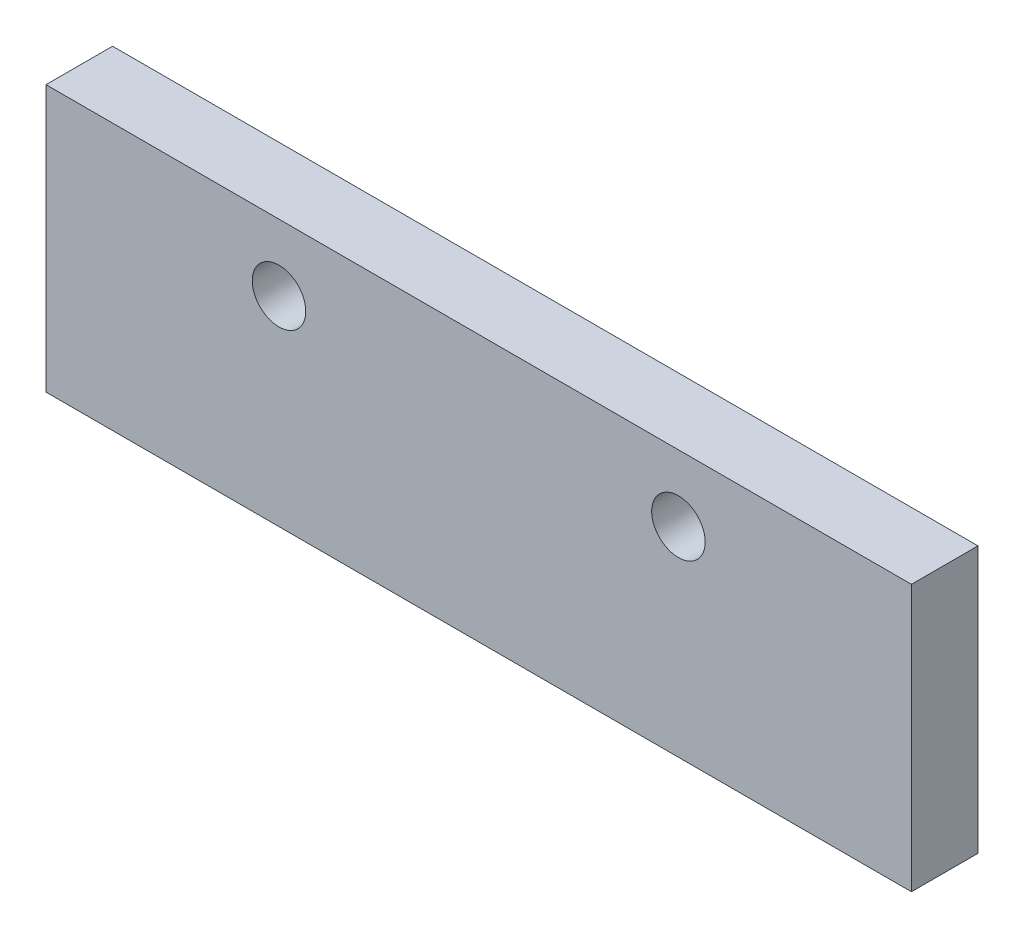
ISO-10303-21;
HEADER;
FILE_DESCRIPTION(('STEP AP214'),'2;1');
FILE_NAME('part.step','',(''),(''),'','','');
FILE_SCHEMA(('AUTOMOTIVE_DESIGN { 1 0 10303 214 1 1 1 1 }'));
ENDSEC;
DATA;
#1=APPLICATION_CONTEXT('core data for automotive mechanical design processes');
#2=APPLICATION_PROTOCOL_DEFINITION('international standard','automotive_design',2000,#1);
#3=PRODUCT_CONTEXT('',#1,'mechanical');
#4=PRODUCT('Part','Part','',(#3));
#5=PRODUCT_RELATED_PRODUCT_CATEGORY('part','',(#4));
#6=PRODUCT_DEFINITION_FORMATION('','',#4);
#7=PRODUCT_DEFINITION_CONTEXT('part definition',#1,'design');
#8=PRODUCT_DEFINITION('design','',#6,#7);
#9=PRODUCT_DEFINITION_SHAPE('','',#8);
#10=(LENGTH_UNIT() NAMED_UNIT(*) SI_UNIT(.MILLI.,.METRE.));
#11=(NAMED_UNIT(*) PLANE_ANGLE_UNIT() SI_UNIT($,.RADIAN.));
#12=(NAMED_UNIT(*) SI_UNIT($,.STERADIAN.) SOLID_ANGLE_UNIT());
#13=UNCERTAINTY_MEASURE_WITH_UNIT(LENGTH_MEASURE(1.E-05),#10,'distance_accuracy_value','');
#14=(GEOMETRIC_REPRESENTATION_CONTEXT(3) GLOBAL_UNCERTAINTY_ASSIGNED_CONTEXT((#13)) GLOBAL_UNIT_ASSIGNED_CONTEXT((#10,
#11,#12)) REPRESENTATION_CONTEXT('',''));
#15=CARTESIAN_POINT('',(0.,0.,0.));
#16=DIRECTION('',(0.,0.,1.));
#17=DIRECTION('',(1.,0.,0.));
#18=AXIS2_PLACEMENT_3D('',#15,#16,#17);
#19=CARTESIAN_POINT('',(0.,0.,0.));
#20=DIRECTION('',(0.,0.,-1.));
#21=DIRECTION('',(-1.,0.,0.));
#22=AXIS2_PLACEMENT_3D('',#19,#20,#21);
#23=PLANE('',#22);
#24=CARTESIAN_POINT('',(60.325,19.05,0.));
#25=DIRECTION('',(0.,0.,1.));
#26=DIRECTION('',(1.,0.,0.));
#27=AXIS2_PLACEMENT_3D('',#24,#25,#26);
#28=CIRCLE('',#27,2.55270000000001);
#29=CARTESIAN_POINT('',(62.8777,19.05,0.));
#30=VERTEX_POINT('',#29);
#31=EDGE_CURVE('E151',#30,#30,#28,.T.);
#32=ORIENTED_EDGE('',*,*,#31,.F.);
#33=EDGE_LOOP('',(#32));
#34=FACE_BOUND('',#33,.T.);
#35=DIRECTION('',(0.,-1.,0.));
#36=VECTOR('',#35,1.);
#37=CARTESIAN_POINT('',(0.,0.,0.));
#38=LINE('',#37,#36);
#39=CARTESIAN_POINT('',(0.,25.4,0.));
#40=VERTEX_POINT('',#39);
#41=CARTESIAN_POINT('',(0.,0.,0.));
#42=VERTEX_POINT('',#41);
#43=EDGE_CURVE('E105',#40,#42,#38,.T.);
#44=ORIENTED_EDGE('',*,*,#43,.T.);
#45=DIRECTION('',(1.,0.,0.));
#46=VECTOR('',#45,1.);
#47=CARTESIAN_POINT('',(0.,0.,0.));
#48=LINE('',#47,#46);
#49=CARTESIAN_POINT('',(82.55,0.,0.));
#50=VERTEX_POINT('',#49);
#51=EDGE_CURVE('E108',#42,#50,#48,.T.);
#52=ORIENTED_EDGE('',*,*,#51,.T.);
#53=DIRECTION('',(0.,1.,0.));
#54=VECTOR('',#53,1.);
#55=CARTESIAN_POINT('',(82.55,0.,0.));
#56=LINE('',#55,#54);
#57=CARTESIAN_POINT('',(82.55,25.4,0.));
#58=VERTEX_POINT('',#57);
#59=EDGE_CURVE('E90',#50,#58,#56,.T.);
#60=ORIENTED_EDGE('',*,*,#59,.T.);
#61=DIRECTION('',(-1.,0.,0.));
#62=VECTOR('',#61,1.);
#63=CARTESIAN_POINT('',(0.,25.4,0.));
#64=LINE('',#63,#62);
#65=EDGE_CURVE('E100',#58,#40,#64,.T.);
#66=ORIENTED_EDGE('',*,*,#65,.T.);
#67=EDGE_LOOP('',(#44,#52,#60,#66));
#68=FACE_BOUND('',#67,.T.);
#69=CARTESIAN_POINT('',(22.225,19.05,0.));
#70=DIRECTION('',(0.,0.,1.));
#71=DIRECTION('',(1.,0.,0.));
#72=AXIS2_PLACEMENT_3D('',#69,#70,#71);
#73=CIRCLE('',#72,2.5527);
#74=CARTESIAN_POINT('',(24.7777,19.05,0.));
#75=VERTEX_POINT('',#74);
#76=EDGE_CURVE('E149',#75,#75,#73,.T.);
#77=ORIENTED_EDGE('',*,*,#76,.F.);
#78=EDGE_LOOP('',(#77));
#79=FACE_BOUND('',#78,.T.);
#80=ADVANCED_FACE('F39',(#34,#68,#79),#23,.F.);
#81=CARTESIAN_POINT('',(0.,0.,-6.35));
#82=DIRECTION('',(-1.,0.,0.));
#83=DIRECTION('',(0.,0.,1.));
#84=AXIS2_PLACEMENT_3D('',#81,#82,#83);
#85=PLANE('',#84);
#86=ORIENTED_EDGE('',*,*,#43,.F.);
#87=DIRECTION('',(0.,0.,1.));
#88=VECTOR('',#87,1.);
#89=CARTESIAN_POINT('',(0.,25.4,-6.35));
#90=LINE('',#89,#88);
#91=CARTESIAN_POINT('',(0.,25.4,-6.35));
#92=VERTEX_POINT('',#91);
#93=EDGE_CURVE('E11',#92,#40,#90,.T.);
#94=ORIENTED_EDGE('',*,*,#93,.F.);
#95=DIRECTION('',(0.,-1.,0.));
#96=VECTOR('',#95,1.);
#97=CARTESIAN_POINT('',(0.,0.,-6.35));
#98=LINE('',#97,#96);
#99=CARTESIAN_POINT('',(0.,0.,-6.35));
#100=VERTEX_POINT('',#99);
#101=EDGE_CURVE('E98',#92,#100,#98,.T.);
#102=ORIENTED_EDGE('',*,*,#101,.T.);
#103=DIRECTION('',(0.,0.,1.));
#104=VECTOR('',#103,1.);
#105=CARTESIAN_POINT('',(0.,0.,-6.35));
#106=LINE('',#105,#104);
#107=EDGE_CURVE('E43',#100,#42,#106,.T.);
#108=ORIENTED_EDGE('',*,*,#107,.T.);
#109=EDGE_LOOP('',(#86,#94,#102,#108));
#110=FACE_BOUND('',#109,.T.);
#111=ADVANCED_FACE('F41',(#110),#85,.T.);
#112=CARTESIAN_POINT('',(0.,25.4,-6.35));
#113=DIRECTION('',(0.,1.,0.));
#114=DIRECTION('',(0.,0.,1.));
#115=AXIS2_PLACEMENT_3D('',#112,#113,#114);
#116=PLANE('',#115);
#117=ORIENTED_EDGE('',*,*,#65,.F.);
#118=DIRECTION('',(0.,0.,1.));
#119=VECTOR('',#118,1.);
#120=CARTESIAN_POINT('',(82.55,25.4,-6.35));
#121=LINE('',#120,#119);
#122=CARTESIAN_POINT('',(82.55,25.4,-6.35));
#123=VERTEX_POINT('',#122);
#124=EDGE_CURVE('E49',#123,#58,#121,.T.);
#125=ORIENTED_EDGE('',*,*,#124,.F.);
#126=DIRECTION('',(-1.,0.,0.));
#127=VECTOR('',#126,1.);
#128=CARTESIAN_POINT('',(0.,25.4,-6.35));
#129=LINE('',#128,#127);
#130=EDGE_CURVE('E95',#123,#92,#129,.T.);
#131=ORIENTED_EDGE('',*,*,#130,.T.);
#132=ORIENTED_EDGE('',*,*,#93,.T.);
#133=EDGE_LOOP('',(#117,#125,#131,#132));
#134=FACE_BOUND('',#133,.T.);
#135=ADVANCED_FACE('F116',(#134),#116,.T.);
#136=CARTESIAN_POINT('',(82.55,0.,-6.35));
#137=DIRECTION('',(1.,0.,0.));
#138=DIRECTION('',(0.,0.,-1.));
#139=AXIS2_PLACEMENT_3D('',#136,#137,#138);
#140=PLANE('',#139);
#141=ORIENTED_EDGE('',*,*,#59,.F.);
#142=DIRECTION('',(0.,0.,1.));
#143=VECTOR('',#142,1.);
#144=CARTESIAN_POINT('',(82.55,0.,-6.35));
#145=LINE('',#144,#143);
#146=CARTESIAN_POINT('',(82.55,0.,-6.35));
#147=VERTEX_POINT('',#146);
#148=EDGE_CURVE('E85',#147,#50,#145,.T.);
#149=ORIENTED_EDGE('',*,*,#148,.F.);
#150=DIRECTION('',(0.,1.,0.));
#151=VECTOR('',#150,1.);
#152=CARTESIAN_POINT('',(82.55,0.,-6.35));
#153=LINE('',#152,#151);
#154=EDGE_CURVE('E88',#147,#123,#153,.T.);
#155=ORIENTED_EDGE('',*,*,#154,.T.);
#156=ORIENTED_EDGE('',*,*,#124,.T.);
#157=EDGE_LOOP('',(#141,#149,#155,#156));
#158=FACE_BOUND('',#157,.T.);
#159=ADVANCED_FACE('F87',(#158),#140,.T.);
#160=CARTESIAN_POINT('',(0.,0.,-6.35));
#161=DIRECTION('',(0.,-1.,0.));
#162=DIRECTION('',(0.,0.,-1.));
#163=AXIS2_PLACEMENT_3D('',#160,#161,#162);
#164=PLANE('',#163);
#165=ORIENTED_EDGE('',*,*,#51,.F.);
#166=ORIENTED_EDGE('',*,*,#107,.F.);
#167=DIRECTION('',(1.,0.,0.));
#168=VECTOR('',#167,1.);
#169=CARTESIAN_POINT('',(0.,0.,-6.35));
#170=LINE('',#169,#168);
#171=EDGE_CURVE('E94',#100,#147,#170,.T.);
#172=ORIENTED_EDGE('',*,*,#171,.T.);
#173=ORIENTED_EDGE('',*,*,#148,.T.);
#174=EDGE_LOOP('',(#165,#166,#172,#173));
#175=FACE_BOUND('',#174,.T.);
#176=ADVANCED_FACE('F97',(#175),#164,.T.);
#177=CARTESIAN_POINT('',(0.,0.,-6.35));
#178=DIRECTION('',(0.,0.,-1.));
#179=DIRECTION('',(-1.,0.,0.));
#180=AXIS2_PLACEMENT_3D('',#177,#178,#179);
#181=PLANE('',#180);
#182=CARTESIAN_POINT('',(22.225,19.05,-6.35));
#183=DIRECTION('',(0.,0.,1.));
#184=DIRECTION('',(1.,0.,0.));
#185=AXIS2_PLACEMENT_3D('',#182,#183,#184);
#186=CIRCLE('',#185,2.5527);
#187=CARTESIAN_POINT('',(24.7777,19.05,-6.35));
#188=VERTEX_POINT('',#187);
#189=EDGE_CURVE('E146',#188,#188,#186,.T.);
#190=ORIENTED_EDGE('',*,*,#189,.T.);
#191=EDGE_LOOP('',(#190));
#192=FACE_BOUND('',#191,.T.);
#193=CARTESIAN_POINT('',(60.325,19.05,-6.35));
#194=DIRECTION('',(0.,0.,1.));
#195=DIRECTION('',(1.,0.,0.));
#196=AXIS2_PLACEMENT_3D('',#193,#194,#195);
#197=CIRCLE('',#196,2.55269999999999);
#198=CARTESIAN_POINT('',(62.8777,19.05,-6.35));
#199=VERTEX_POINT('',#198);
#200=EDGE_CURVE('E109',#199,#199,#197,.T.);
#201=ORIENTED_EDGE('',*,*,#200,.T.);
#202=EDGE_LOOP('',(#201));
#203=FACE_BOUND('',#202,.T.);
#204=ORIENTED_EDGE('',*,*,#101,.F.);
#205=ORIENTED_EDGE('',*,*,#130,.F.);
#206=ORIENTED_EDGE('',*,*,#154,.F.);
#207=ORIENTED_EDGE('',*,*,#171,.F.);
#208=EDGE_LOOP('',(#204,#205,#206,#207));
#209=FACE_BOUND('',#208,.T.);
#210=ADVANCED_FACE('F93',(#192,#203,#209),#181,.T.);
#211=CARTESIAN_POINT('',(60.325,19.05,0.));
#212=DIRECTION('',(0.,0.,1.));
#213=DIRECTION('',(1.,0.,0.));
#214=AXIS2_PLACEMENT_3D('',#211,#212,#213);
#215=CYLINDRICAL_SURFACE('',#214,2.5527);
#216=ORIENTED_EDGE('',*,*,#200,.F.);
#217=EDGE_LOOP('',(#216));
#218=FACE_BOUND('',#217,.T.);
#219=ORIENTED_EDGE('',*,*,#31,.T.);
#220=EDGE_LOOP('',(#219));
#221=FACE_BOUND('',#220,.T.);
#222=ADVANCED_FACE('F133',(#218,#221),#215,.F.);
#223=CARTESIAN_POINT('',(22.225,19.05,0.));
#224=DIRECTION('',(0.,0.,1.));
#225=DIRECTION('',(1.,0.,0.));
#226=AXIS2_PLACEMENT_3D('',#223,#224,#225);
#227=CYLINDRICAL_SURFACE('',#226,2.5527);
#228=ORIENTED_EDGE('',*,*,#189,.F.);
#229=EDGE_LOOP('',(#228));
#230=FACE_BOUND('',#229,.T.);
#231=ORIENTED_EDGE('',*,*,#76,.T.);
#232=EDGE_LOOP('',(#231));
#233=FACE_BOUND('',#232,.T.);
#234=ADVANCED_FACE('F137',(#230,#233),#227,.F.);
#235=CLOSED_SHELL('',(#80,#111,#135,#159,#176,#210,#222,#234));
#236=MANIFOLD_SOLID_BREP('B2',#235);
#237=ADVANCED_BREP_SHAPE_REPRESENTATION('',(#18,#236),#14);
#238=SHAPE_DEFINITION_REPRESENTATION(#9,#237);
ENDSEC;
END-ISO-10303-21;
